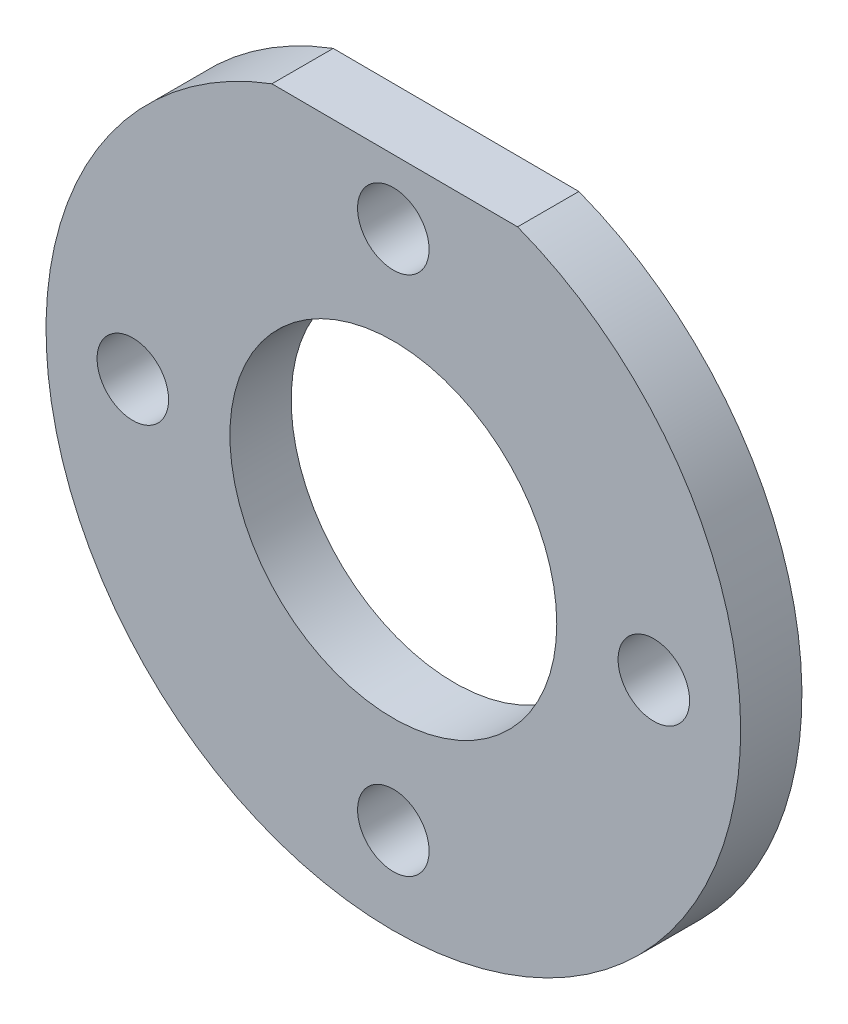
ISO-10303-21;
HEADER;
FILE_DESCRIPTION(('STEP AP214'),'2;1');
FILE_NAME('part.step','',(''),(''),'','','');
FILE_SCHEMA(('AUTOMOTIVE_DESIGN { 1 0 10303 214 1 1 1 1 }'));
ENDSEC;
DATA;
#1=APPLICATION_CONTEXT('core data for automotive mechanical design processes');
#2=APPLICATION_PROTOCOL_DEFINITION('international standard','automotive_design',2000,#1);
#3=PRODUCT_CONTEXT('',#1,'mechanical');
#4=PRODUCT('Part','Part','',(#3));
#5=PRODUCT_RELATED_PRODUCT_CATEGORY('part','',(#4));
#6=PRODUCT_DEFINITION_FORMATION('','',#4);
#7=PRODUCT_DEFINITION_CONTEXT('part definition',#1,'design');
#8=PRODUCT_DEFINITION('design','',#6,#7);
#9=PRODUCT_DEFINITION_SHAPE('','',#8);
#10=(LENGTH_UNIT() NAMED_UNIT(*) SI_UNIT(.MILLI.,.METRE.));
#11=(NAMED_UNIT(*) PLANE_ANGLE_UNIT() SI_UNIT($,.RADIAN.));
#12=(NAMED_UNIT(*) SI_UNIT($,.STERADIAN.) SOLID_ANGLE_UNIT());
#13=UNCERTAINTY_MEASURE_WITH_UNIT(LENGTH_MEASURE(1.E-05),#10,'distance_accuracy_value','');
#14=(GEOMETRIC_REPRESENTATION_CONTEXT(3) GLOBAL_UNCERTAINTY_ASSIGNED_CONTEXT((#13)) GLOBAL_UNIT_ASSIGNED_CONTEXT((#10,
#11,#12)) REPRESENTATION_CONTEXT('',''));
#15=CARTESIAN_POINT('',(0.,0.,0.));
#16=DIRECTION('',(0.,0.,1.));
#17=DIRECTION('',(1.,0.,0.));
#18=AXIS2_PLACEMENT_3D('',#15,#16,#17);
#19=CARTESIAN_POINT('',(0.,0.,6.));
#20=DIRECTION('',(0.,0.,1.));
#21=DIRECTION('',(1.,0.,0.));
#22=AXIS2_PLACEMENT_3D('',#19,#20,#21);
#23=PLANE('',#22);
#24=DIRECTION('',(0.999990388379008,-0.00438442123906912,0.));
#25=VECTOR('',#24,1.);
#26=CARTESIAN_POINT('',(-11.8840803618202,31.8554333505887,6.));
#27=LINE('',#26,#25);
#28=CARTESIAN_POINT('',(-11.8840803618202,31.8554333505887,6.));
#29=VERTEX_POINT('',#28);
#30=CARTESIAN_POINT('',(12.1629560551701,31.75,6.));
#31=VERTEX_POINT('',#30);
#32=EDGE_CURVE('E59',#29,#31,#27,.T.);
#33=ORIENTED_EDGE('',*,*,#32,.F.);
#34=CARTESIAN_POINT('',(0.,0.,6.));
#35=DIRECTION('',(0.,0.,1.));
#36=DIRECTION('',(1.,0.,0.));
#37=AXIS2_PLACEMENT_3D('',#34,#35,#36);
#38=CIRCLE('',#37,34.);
#39=EDGE_CURVE('E76',#29,#31,#38,.T.);
#40=ORIENTED_EDGE('',*,*,#39,.T.);
#41=EDGE_LOOP('',(#33,#40));
#42=FACE_BOUND('',#41,.T.);
#43=CARTESIAN_POINT('',(1.44013863293713E-12,-25.5,6.));
#44=DIRECTION('',(0.,0.,1.));
#45=DIRECTION('',(1.,0.,0.));
#46=AXIS2_PLACEMENT_3D('',#43,#44,#45);
#47=CIRCLE('',#46,3.50000000000155);
#48=CARTESIAN_POINT('',(3.50000000000299,-25.5,6.));
#49=VERTEX_POINT('',#48);
#50=EDGE_CURVE('E107',#49,#49,#47,.T.);
#51=ORIENTED_EDGE('',*,*,#50,.F.);
#52=EDGE_LOOP('',(#51));
#53=FACE_BOUND('',#52,.T.);
#54=CARTESIAN_POINT('',(0.,25.5,6.));
#55=DIRECTION('',(0.,0.,1.));
#56=DIRECTION('',(1.,0.,0.));
#57=AXIS2_PLACEMENT_3D('',#54,#55,#56);
#58=CIRCLE('',#57,3.5);
#59=CARTESIAN_POINT('',(3.5,25.5,6.));
#60=VERTEX_POINT('',#59);
#61=EDGE_CURVE('E91',#60,#60,#58,.T.);
#62=ORIENTED_EDGE('',*,*,#61,.F.);
#63=EDGE_LOOP('',(#62));
#64=FACE_BOUND('',#63,.T.);
#65=CARTESIAN_POINT('',(0.,0.,6.));
#66=DIRECTION('',(0.,0.,1.));
#67=DIRECTION('',(1.,0.,0.));
#68=AXIS2_PLACEMENT_3D('',#65,#66,#67);
#69=CIRCLE('',#68,16.);
#70=CARTESIAN_POINT('',(16.,0.,6.));
#71=VERTEX_POINT('',#70);
#72=EDGE_CURVE('E84',#71,#71,#69,.T.);
#73=ORIENTED_EDGE('',*,*,#72,.F.);
#74=EDGE_LOOP('',(#73));
#75=FACE_BOUND('',#74,.T.);
#76=CARTESIAN_POINT('',(25.5000000000007,7.20069316468564E-13,6.));
#77=DIRECTION('',(0.,0.,1.));
#78=DIRECTION('',(1.,0.,0.));
#79=AXIS2_PLACEMENT_3D('',#76,#77,#78);
#80=CIRCLE('',#79,3.50000000000056);
#81=CARTESIAN_POINT('',(29.0000000000013,7.20069316468564E-13,6.));
#82=VERTEX_POINT('',#81);
#83=EDGE_CURVE('E99',#82,#82,#80,.T.);
#84=ORIENTED_EDGE('',*,*,#83,.F.);
#85=EDGE_LOOP('',(#84));
#86=FACE_BOUND('',#85,.T.);
#87=CARTESIAN_POINT('',(-25.4999999999993,-7.23192165806389E-13,6.));
#88=DIRECTION('',(0.,0.,1.));
#89=DIRECTION('',(1.,0.,0.));
#90=AXIS2_PLACEMENT_3D('',#87,#88,#89);
#91=CIRCLE('',#90,3.50000000000116);
#92=CARTESIAN_POINT('',(-21.9999999999981,-7.23192165806389E-13,6.));
#93=VERTEX_POINT('',#92);
#94=EDGE_CURVE('E115',#93,#93,#91,.T.);
#95=ORIENTED_EDGE('',*,*,#94,.F.);
#96=EDGE_LOOP('',(#95));
#97=FACE_BOUND('',#96,.T.);
#98=ADVANCED_FACE('F43',(#42,#53,#64,#75,#86,#97),#23,.T.);
#99=CARTESIAN_POINT('',(0.,0.,0.));
#100=DIRECTION('',(0.,0.,1.));
#101=DIRECTION('',(1.,0.,0.));
#102=AXIS2_PLACEMENT_3D('',#99,#100,#101);
#103=PLANE('',#102);
#104=CARTESIAN_POINT('',(0.,0.,0.));
#105=DIRECTION('',(0.,0.,1.));
#106=DIRECTION('',(1.,0.,0.));
#107=AXIS2_PLACEMENT_3D('',#104,#105,#106);
#108=CIRCLE('',#107,34.);
#109=CARTESIAN_POINT('',(-11.8840803618202,31.8554333505887,0.));
#110=VERTEX_POINT('',#109);
#111=CARTESIAN_POINT('',(12.1629560551701,31.75,0.));
#112=VERTEX_POINT('',#111);
#113=EDGE_CURVE('E80',#110,#112,#108,.T.);
#114=ORIENTED_EDGE('',*,*,#113,.F.);
#115=DIRECTION('',(0.999990388379008,-0.00438442123906912,0.));
#116=VECTOR('',#115,1.);
#117=CARTESIAN_POINT('',(0.139437846674992,31.8027166752944,0.));
#118=LINE('',#117,#116);
#119=EDGE_CURVE('E68',#110,#112,#118,.T.);
#120=ORIENTED_EDGE('',*,*,#119,.T.);
#121=EDGE_LOOP('',(#114,#120));
#122=FACE_BOUND('',#121,.T.);
#123=CARTESIAN_POINT('',(0.,0.,0.));
#124=DIRECTION('',(0.,0.,1.));
#125=DIRECTION('',(1.,0.,0.));
#126=AXIS2_PLACEMENT_3D('',#123,#124,#125);
#127=CIRCLE('',#126,16.);
#128=CARTESIAN_POINT('',(16.,0.,0.));
#129=VERTEX_POINT('',#128);
#130=EDGE_CURVE('E87',#129,#129,#127,.T.);
#131=ORIENTED_EDGE('',*,*,#130,.T.);
#132=EDGE_LOOP('',(#131));
#133=FACE_BOUND('',#132,.T.);
#134=CARTESIAN_POINT('',(0.,25.5,0.));
#135=DIRECTION('',(0.,0.,1.));
#136=DIRECTION('',(1.,0.,0.));
#137=AXIS2_PLACEMENT_3D('',#134,#135,#136);
#138=CIRCLE('',#137,3.5);
#139=CARTESIAN_POINT('',(3.5,25.5,0.));
#140=VERTEX_POINT('',#139);
#141=EDGE_CURVE('E95',#140,#140,#138,.T.);
#142=ORIENTED_EDGE('',*,*,#141,.T.);
#143=EDGE_LOOP('',(#142));
#144=FACE_BOUND('',#143,.T.);
#145=CARTESIAN_POINT('',(25.5000000000007,7.20069316468564E-13,0.));
#146=DIRECTION('',(0.,0.,1.));
#147=DIRECTION('',(1.,0.,0.));
#148=AXIS2_PLACEMENT_3D('',#145,#146,#147);
#149=CIRCLE('',#148,3.50000000000056);
#150=CARTESIAN_POINT('',(29.0000000000013,7.20069316468564E-13,0.));
#151=VERTEX_POINT('',#150);
#152=EDGE_CURVE('E103',#151,#151,#149,.T.);
#153=ORIENTED_EDGE('',*,*,#152,.T.);
#154=EDGE_LOOP('',(#153));
#155=FACE_BOUND('',#154,.T.);
#156=CARTESIAN_POINT('',(1.44013863293713E-12,-25.5,0.));
#157=DIRECTION('',(0.,0.,1.));
#158=DIRECTION('',(1.,0.,0.));
#159=AXIS2_PLACEMENT_3D('',#156,#157,#158);
#160=CIRCLE('',#159,3.50000000000155);
#161=CARTESIAN_POINT('',(3.50000000000299,-25.5,0.));
#162=VERTEX_POINT('',#161);
#163=EDGE_CURVE('E111',#162,#162,#160,.T.);
#164=ORIENTED_EDGE('',*,*,#163,.T.);
#165=EDGE_LOOP('',(#164));
#166=FACE_BOUND('',#165,.T.);
#167=CARTESIAN_POINT('',(-25.4999999999993,-7.23192165806389E-13,0.));
#168=DIRECTION('',(0.,0.,1.));
#169=DIRECTION('',(1.,0.,0.));
#170=AXIS2_PLACEMENT_3D('',#167,#168,#169);
#171=CIRCLE('',#170,3.50000000000116);
#172=CARTESIAN_POINT('',(-21.9999999999981,-7.23192165806389E-13,0.));
#173=VERTEX_POINT('',#172);
#174=EDGE_CURVE('E119',#173,#173,#171,.T.);
#175=ORIENTED_EDGE('',*,*,#174,.T.);
#176=EDGE_LOOP('',(#175));
#177=FACE_BOUND('',#176,.T.);
#178=ADVANCED_FACE('F128',(#122,#133,#144,#155,#166,#177),#103,.F.);
#179=CARTESIAN_POINT('',(0.,0.,6.));
#180=DIRECTION('',(0.,0.,-1.));
#181=DIRECTION('',(-1.,0.,0.));
#182=AXIS2_PLACEMENT_3D('',#179,#180,#181);
#183=CYLINDRICAL_SURFACE('',#182,34.);
#184=ORIENTED_EDGE('',*,*,#39,.F.);
#185=DIRECTION('',(0.,0.,-1.));
#186=VECTOR('',#185,1.);
#187=CARTESIAN_POINT('',(-11.8840803618202,31.8554333505887,6.));
#188=LINE('',#187,#186);
#189=EDGE_CURVE('E11',#29,#110,#188,.T.);
#190=ORIENTED_EDGE('',*,*,#189,.T.);
#191=ORIENTED_EDGE('',*,*,#113,.T.);
#192=DIRECTION('',(0.,0.,-1.));
#193=VECTOR('',#192,1.);
#194=CARTESIAN_POINT('',(12.1629560551702,31.75,6.));
#195=LINE('',#194,#193);
#196=EDGE_CURVE('E52',#112,#31,#195,.F.);
#197=ORIENTED_EDGE('',*,*,#196,.T.);
#198=EDGE_LOOP('',(#184,#190,#191,#197));
#199=FACE_BOUND('',#198,.T.);
#200=ADVANCED_FACE('F45',(#199),#183,.T.);
#201=CARTESIAN_POINT('',(0.,0.,6.));
#202=DIRECTION('',(0.,0.,-1.));
#203=DIRECTION('',(-1.,0.,0.));
#204=AXIS2_PLACEMENT_3D('',#201,#202,#203);
#205=CYLINDRICAL_SURFACE('',#204,16.);
#206=ORIENTED_EDGE('',*,*,#72,.T.);
#207=EDGE_LOOP('',(#206));
#208=FACE_BOUND('',#207,.T.);
#209=ORIENTED_EDGE('',*,*,#130,.F.);
#210=EDGE_LOOP('',(#209));
#211=FACE_BOUND('',#210,.T.);
#212=ADVANCED_FACE('F159',(#208,#211),#205,.F.);
#213=CARTESIAN_POINT('',(0.,25.5,6.));
#214=DIRECTION('',(0.,0.,-1.));
#215=DIRECTION('',(-1.,0.,0.));
#216=AXIS2_PLACEMENT_3D('',#213,#214,#215);
#217=CYLINDRICAL_SURFACE('',#216,3.5);
#218=ORIENTED_EDGE('',*,*,#61,.T.);
#219=EDGE_LOOP('',(#218));
#220=FACE_BOUND('',#219,.T.);
#221=ORIENTED_EDGE('',*,*,#141,.F.);
#222=EDGE_LOOP('',(#221));
#223=FACE_BOUND('',#222,.T.);
#224=ADVANCED_FACE('F162',(#220,#223),#217,.F.);
#225=CARTESIAN_POINT('',(25.5000000000007,7.20069316468564E-13,6.));
#226=DIRECTION('',(0.,0.,-1.));
#227=DIRECTION('',(-1.,0.,0.));
#228=AXIS2_PLACEMENT_3D('',#225,#226,#227);
#229=CYLINDRICAL_SURFACE('',#228,3.50000000000056);
#230=ORIENTED_EDGE('',*,*,#83,.T.);
#231=EDGE_LOOP('',(#230));
#232=FACE_BOUND('',#231,.T.);
#233=ORIENTED_EDGE('',*,*,#152,.F.);
#234=EDGE_LOOP('',(#233));
#235=FACE_BOUND('',#234,.T.);
#236=ADVANCED_FACE('F151',(#232,#235),#229,.F.);
#237=CARTESIAN_POINT('',(1.44013863293713E-12,-25.5,6.));
#238=DIRECTION('',(0.,0.,-1.));
#239=DIRECTION('',(-1.,0.,0.));
#240=AXIS2_PLACEMENT_3D('',#237,#238,#239);
#241=CYLINDRICAL_SURFACE('',#240,3.50000000000155);
#242=ORIENTED_EDGE('',*,*,#50,.T.);
#243=EDGE_LOOP('',(#242));
#244=FACE_BOUND('',#243,.T.);
#245=ORIENTED_EDGE('',*,*,#163,.F.);
#246=EDGE_LOOP('',(#245));
#247=FACE_BOUND('',#246,.T.);
#248=ADVANCED_FACE('F143',(#244,#247),#241,.F.);
#249=CARTESIAN_POINT('',(-25.4999999999993,-7.23192165806389E-13,6.));
#250=DIRECTION('',(0.,0.,-1.));
#251=DIRECTION('',(-1.,0.,0.));
#252=AXIS2_PLACEMENT_3D('',#249,#250,#251);
#253=CYLINDRICAL_SURFACE('',#252,3.50000000000116);
#254=ORIENTED_EDGE('',*,*,#94,.T.);
#255=EDGE_LOOP('',(#254));
#256=FACE_BOUND('',#255,.T.);
#257=ORIENTED_EDGE('',*,*,#174,.F.);
#258=EDGE_LOOP('',(#257));
#259=FACE_BOUND('',#258,.T.);
#260=ADVANCED_FACE('F141',(#256,#259),#253,.F.);
#261=CARTESIAN_POINT('',(-11.8840803618202,31.8554333505887,-4.));
#262=DIRECTION('',(-0.00438442123906912,-0.999990388379008,0.));
#263=DIRECTION('',(0.999990388379008,-0.00438442123906912,0.));
#264=AXIS2_PLACEMENT_3D('',#261,#262,#263);
#265=PLANE('',#264);
#266=ORIENTED_EDGE('',*,*,#189,.F.);
#267=ORIENTED_EDGE('',*,*,#32,.T.);
#268=ORIENTED_EDGE('',*,*,#196,.F.);
#269=ORIENTED_EDGE('',*,*,#119,.F.);
#270=EDGE_LOOP('',(#266,#267,#268,#269));
#271=FACE_BOUND('',#270,.T.);
#272=ADVANCED_FACE('F67',(#271),#265,.F.);
#273=CLOSED_SHELL('',(#98,#178,#200,#212,#224,#236,#248,#260,#272));
#274=MANIFOLD_SOLID_BREP('B2',#273);
#275=ADVANCED_BREP_SHAPE_REPRESENTATION('',(#18,#274),#14);
#276=SHAPE_DEFINITION_REPRESENTATION(#9,#275);
ENDSEC;
END-ISO-10303-21;
